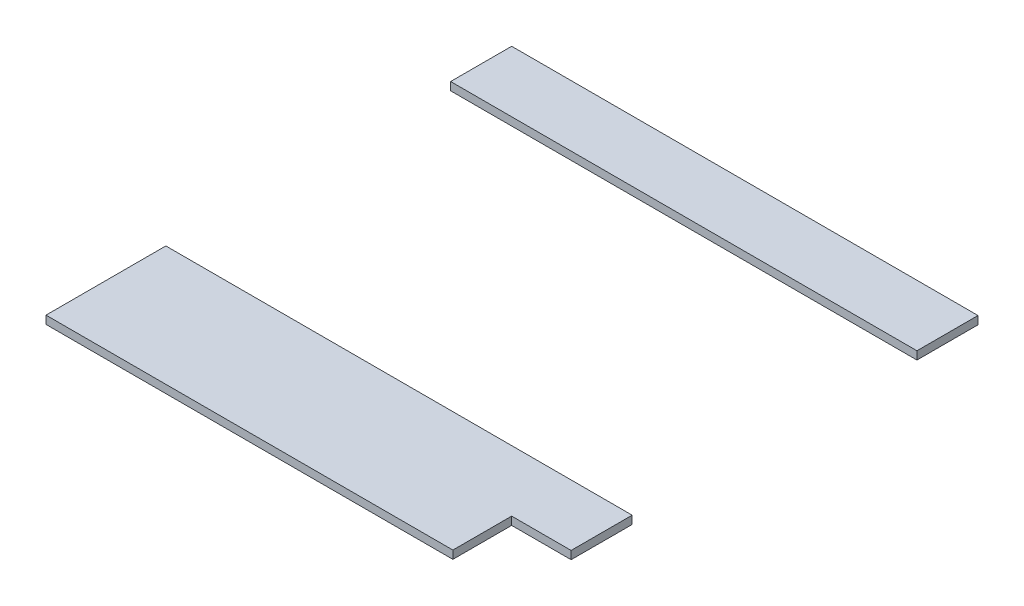
ISO-10303-21;
HEADER;
FILE_DESCRIPTION(('STEP AP214'),'2;1');
FILE_NAME('part.step','',(''),(''),'','','');
FILE_SCHEMA(('AUTOMOTIVE_DESIGN { 1 0 10303 214 1 1 1 1 }'));
ENDSEC;
DATA;
#1=APPLICATION_CONTEXT('core data for automotive mechanical design processes');
#2=APPLICATION_PROTOCOL_DEFINITION('international standard','automotive_design',2000,#1);
#3=PRODUCT_CONTEXT('',#1,'mechanical');
#4=PRODUCT('Part','Part','',(#3));
#5=PRODUCT_RELATED_PRODUCT_CATEGORY('part','',(#4));
#6=PRODUCT_DEFINITION_FORMATION('','',#4);
#7=PRODUCT_DEFINITION_CONTEXT('part definition',#1,'design');
#8=PRODUCT_DEFINITION('design','',#6,#7);
#9=PRODUCT_DEFINITION_SHAPE('','',#8);
#10=(LENGTH_UNIT() NAMED_UNIT(*) SI_UNIT(.MILLI.,.METRE.));
#11=(NAMED_UNIT(*) PLANE_ANGLE_UNIT() SI_UNIT($,.RADIAN.));
#12=(NAMED_UNIT(*) SI_UNIT($,.STERADIAN.) SOLID_ANGLE_UNIT());
#13=UNCERTAINTY_MEASURE_WITH_UNIT(LENGTH_MEASURE(1.E-05),#10,'distance_accuracy_value','');
#14=(GEOMETRIC_REPRESENTATION_CONTEXT(3) GLOBAL_UNCERTAINTY_ASSIGNED_CONTEXT((#13)) GLOBAL_UNIT_ASSIGNED_CONTEXT((#10,
#11,#12)) REPRESENTATION_CONTEXT('',''));
#15=CARTESIAN_POINT('',(0.,0.,0.));
#16=DIRECTION('',(0.,0.,1.));
#17=DIRECTION('',(1.,0.,0.));
#18=AXIS2_PLACEMENT_3D('',#15,#16,#17);
#19=CARTESIAN_POINT('',(104.2,-3.20000000000002,-80.6395610261527));
#20=DIRECTION('',(1.,0.,0.));
#21=DIRECTION('',(0.,0.,-1.));
#22=AXIS2_PLACEMENT_3D('',#19,#20,#21);
#23=PLANE('',#22);
#24=DIRECTION('',(0.,0.,-1.));
#25=VECTOR('',#24,1.);
#26=CARTESIAN_POINT('',(104.2,0.,-80.6395610261527));
#27=LINE('',#26,#25);
#28=CARTESIAN_POINT('',(104.2,0.,-56.4395610261526));
#29=VERTEX_POINT('',#28);
#30=CARTESIAN_POINT('',(104.2,0.,-80.6395610261527));
#31=VERTEX_POINT('',#30);
#32=EDGE_CURVE('E107',#29,#31,#27,.T.);
#33=ORIENTED_EDGE('',*,*,#32,.F.);
#34=DIRECTION('',(0.,1.,0.));
#35=VECTOR('',#34,1.);
#36=CARTESIAN_POINT('',(104.2,-3.20000000000002,-56.4395610261526));
#37=LINE('',#36,#35);
#38=CARTESIAN_POINT('',(104.2,-3.20000000000002,-56.4395610261526));
#39=VERTEX_POINT('',#38);
#40=EDGE_CURVE('E12',#39,#29,#37,.T.);
#41=ORIENTED_EDGE('',*,*,#40,.F.);
#42=DIRECTION('',(0.,0.,-1.));
#43=VECTOR('',#42,1.);
#44=CARTESIAN_POINT('',(104.2,-3.20000000000002,-80.6395610261527));
#45=LINE('',#44,#43);
#46=CARTESIAN_POINT('',(104.2,-3.20000000000002,-80.6395610261527));
#47=VERTEX_POINT('',#46);
#48=EDGE_CURVE('E101',#39,#47,#45,.T.);
#49=ORIENTED_EDGE('',*,*,#48,.T.);
#50=DIRECTION('',(0.,1.,0.));
#51=VECTOR('',#50,1.);
#52=CARTESIAN_POINT('',(104.2,-3.20000000000002,-80.6395610261527));
#53=LINE('',#52,#51);
#54=EDGE_CURVE('E46',#47,#31,#53,.T.);
#55=ORIENTED_EDGE('',*,*,#54,.T.);
#56=EDGE_LOOP('',(#33,#41,#49,#55));
#57=FACE_BOUND('',#56,.T.);
#58=ADVANCED_FACE('F43',(#57),#23,.T.);
#59=CARTESIAN_POINT('',(104.2,-3.20000000000002,-56.4395610261526));
#60=DIRECTION('',(0.,0.,1.));
#61=DIRECTION('',(1.,0.,0.));
#62=AXIS2_PLACEMENT_3D('',#59,#60,#61);
#63=PLANE('',#62);
#64=DIRECTION('',(1.,0.,0.));
#65=VECTOR('',#64,1.);
#66=CARTESIAN_POINT('',(104.2,0.,-56.4395610261526));
#67=LINE('',#66,#65);
#68=CARTESIAN_POINT('',(-80.6395610261527,0.,-56.4395610261526));
#69=VERTEX_POINT('',#68);
#70=EDGE_CURVE('E103',#69,#29,#67,.T.);
#71=ORIENTED_EDGE('',*,*,#70,.F.);
#72=DIRECTION('',(0.,1.,0.));
#73=VECTOR('',#72,1.);
#74=CARTESIAN_POINT('',(-80.6395610261527,-3.20000000000002,-56.4395610261526));
#75=LINE('',#74,#73);
#76=CARTESIAN_POINT('',(-80.6395610261527,-3.20000000000002,-56.4395610261526));
#77=VERTEX_POINT('',#76);
#78=EDGE_CURVE('E52',#77,#69,#75,.T.);
#79=ORIENTED_EDGE('',*,*,#78,.F.);
#80=DIRECTION('',(1.,0.,0.));
#81=VECTOR('',#80,1.);
#82=CARTESIAN_POINT('',(104.2,-3.20000000000002,-56.4395610261526));
#83=LINE('',#82,#81);
#84=EDGE_CURVE('E98',#77,#39,#83,.T.);
#85=ORIENTED_EDGE('',*,*,#84,.T.);
#86=ORIENTED_EDGE('',*,*,#40,.T.);
#87=EDGE_LOOP('',(#71,#79,#85,#86));
#88=FACE_BOUND('',#87,.T.);
#89=ADVANCED_FACE('F117',(#88),#63,.T.);
#90=CARTESIAN_POINT('',(-80.6395610261527,-3.20000000000002,-56.4395610261526));
#91=DIRECTION('',(-1.,0.,0.));
#92=DIRECTION('',(0.,0.,1.));
#93=AXIS2_PLACEMENT_3D('',#90,#91,#92);
#94=PLANE('',#93);
#95=DIRECTION('',(0.,0.,1.));
#96=VECTOR('',#95,1.);
#97=CARTESIAN_POINT('',(-80.6395610261527,0.,-56.4395610261526));
#98=LINE('',#97,#96);
#99=CARTESIAN_POINT('',(-80.6395610261527,0.,-80.6395610261527));
#100=VERTEX_POINT('',#99);
#101=EDGE_CURVE('E93',#100,#69,#98,.T.);
#102=ORIENTED_EDGE('',*,*,#101,.F.);
#103=DIRECTION('',(0.,1.,0.));
#104=VECTOR('',#103,1.);
#105=CARTESIAN_POINT('',(-80.6395610261527,-3.20000000000002,-80.6395610261527));
#106=LINE('',#105,#104);
#107=CARTESIAN_POINT('',(-80.6395610261527,-3.20000000000002,-80.6395610261527));
#108=VERTEX_POINT('',#107);
#109=EDGE_CURVE('E88',#108,#100,#106,.T.);
#110=ORIENTED_EDGE('',*,*,#109,.F.);
#111=DIRECTION('',(0.,0.,1.));
#112=VECTOR('',#111,1.);
#113=CARTESIAN_POINT('',(-80.6395610261527,-3.20000000000002,-56.4395610261526));
#114=LINE('',#113,#112);
#115=EDGE_CURVE('E91',#108,#77,#114,.T.);
#116=ORIENTED_EDGE('',*,*,#115,.T.);
#117=ORIENTED_EDGE('',*,*,#78,.T.);
#118=EDGE_LOOP('',(#102,#110,#116,#117));
#119=FACE_BOUND('',#118,.T.);
#120=ADVANCED_FACE('F90',(#119),#94,.T.);
#121=CARTESIAN_POINT('',(-80.6395610261527,-3.20000000000002,-80.6395610261527));
#122=DIRECTION('',(0.,0.,-1.));
#123=DIRECTION('',(-1.,0.,0.));
#124=AXIS2_PLACEMENT_3D('',#121,#122,#123);
#125=PLANE('',#124);
#126=DIRECTION('',(-1.,0.,0.));
#127=VECTOR('',#126,1.);
#128=CARTESIAN_POINT('',(-80.6395610261527,0.,-80.6395610261527));
#129=LINE('',#128,#127);
#130=EDGE_CURVE('E110',#31,#100,#129,.T.);
#131=ORIENTED_EDGE('',*,*,#130,.F.);
#132=ORIENTED_EDGE('',*,*,#54,.F.);
#133=DIRECTION('',(-1.,0.,0.));
#134=VECTOR('',#133,1.);
#135=CARTESIAN_POINT('',(-80.6395610261527,-3.20000000000002,-80.6395610261527));
#136=LINE('',#135,#134);
#137=EDGE_CURVE('E97',#47,#108,#136,.T.);
#138=ORIENTED_EDGE('',*,*,#137,.T.);
#139=ORIENTED_EDGE('',*,*,#109,.T.);
#140=EDGE_LOOP('',(#131,#132,#138,#139));
#141=FACE_BOUND('',#140,.T.);
#142=ADVANCED_FACE('F100',(#141),#125,.T.);
#143=CARTESIAN_POINT('',(0.,-3.20000000000002,0.));
#144=DIRECTION('',(0.,-1.,0.));
#145=DIRECTION('',(0.,0.,-1.));
#146=AXIS2_PLACEMENT_3D('',#143,#144,#145);
#147=PLANE('',#146);
#148=ORIENTED_EDGE('',*,*,#48,.F.);
#149=ORIENTED_EDGE('',*,*,#84,.F.);
#150=ORIENTED_EDGE('',*,*,#115,.F.);
#151=ORIENTED_EDGE('',*,*,#137,.F.);
#152=EDGE_LOOP('',(#148,#149,#150,#151));
#153=FACE_BOUND('',#152,.T.);
#154=ADVANCED_FACE('F96',(#153),#147,.T.);
#155=CARTESIAN_POINT('',(0.,0.,0.));
#156=DIRECTION('',(0.,-1.,0.));
#157=DIRECTION('',(0.,0.,-1.));
#158=AXIS2_PLACEMENT_3D('',#155,#156,#157);
#159=PLANE('',#158);
#160=ORIENTED_EDGE('',*,*,#32,.T.);
#161=ORIENTED_EDGE('',*,*,#130,.T.);
#162=ORIENTED_EDGE('',*,*,#101,.T.);
#163=ORIENTED_EDGE('',*,*,#70,.T.);
#164=EDGE_LOOP('',(#160,#161,#162,#163));
#165=FACE_BOUND('',#164,.T.);
#166=ADVANCED_FACE('F116',(#165),#159,.F.);
#167=CLOSED_SHELL('',(#58,#89,#120,#142,#154,#166));
#168=MANIFOLD_SOLID_BREP('B2',#167);
#169=CARTESIAN_POINT('',(-80.6395610261527,-3.20000000000002,103.939561026153));
#170=DIRECTION('',(-1.,0.,0.));
#171=DIRECTION('',(0.,0.,1.));
#172=AXIS2_PLACEMENT_3D('',#169,#170,#171);
#173=PLANE('',#172);
#174=DIRECTION('',(0.,0.,1.));
#175=VECTOR('',#174,1.);
#176=CARTESIAN_POINT('',(-80.6395610261527,0.,103.939561026153));
#177=LINE('',#176,#175);
#178=CARTESIAN_POINT('',(-80.6395610261527,0.,56.4395610261526));
#179=VERTEX_POINT('',#178);
#180=CARTESIAN_POINT('',(-80.6395610261527,0.,103.939561026153));
#181=VERTEX_POINT('',#180);
#182=EDGE_CURVE('E252',#179,#181,#177,.T.);
#183=ORIENTED_EDGE('',*,*,#182,.F.);
#184=DIRECTION('',(0.,1.,0.));
#185=VECTOR('',#184,1.);
#186=CARTESIAN_POINT('',(-80.6395610261527,-3.20000000000002,56.4395610261526));
#187=LINE('',#186,#185);
#188=CARTESIAN_POINT('',(-80.6395610261527,-3.20000000000002,56.4395610261526));
#189=VERTEX_POINT('',#188);
#190=EDGE_CURVE('E41',#189,#179,#187,.T.);
#191=ORIENTED_EDGE('',*,*,#190,.F.);
#192=DIRECTION('',(0.,0.,1.));
#193=VECTOR('',#192,1.);
#194=CARTESIAN_POINT('',(-80.6395610261527,-3.20000000000002,103.939561026153));
#195=LINE('',#194,#193);
#196=CARTESIAN_POINT('',(-80.6395610261527,-3.20000000000002,103.939561026153));
#197=VERTEX_POINT('',#196);
#198=EDGE_CURVE('E266',#189,#197,#195,.T.);
#199=ORIENTED_EDGE('',*,*,#198,.T.);
#200=DIRECTION('',(0.,1.,0.));
#201=VECTOR('',#200,1.);
#202=CARTESIAN_POINT('',(-80.6395610261527,-3.20000000000002,103.939561026153));
#203=LINE('',#202,#201);
#204=EDGE_CURVE('E170',#197,#181,#203,.T.);
#205=ORIENTED_EDGE('',*,*,#204,.T.);
#206=EDGE_LOOP('',(#183,#191,#199,#205));
#207=FACE_BOUND('',#206,.T.);
#208=ADVANCED_FACE('F167',(#207),#173,.T.);
#209=CARTESIAN_POINT('',(-80.6395610261527,-3.20000000000002,56.4395610261526));
#210=DIRECTION('',(0.,0.,-1.));
#211=DIRECTION('',(-1.,0.,0.));
#212=AXIS2_PLACEMENT_3D('',#209,#210,#211);
#213=PLANE('',#212);
#214=DIRECTION('',(-1.,0.,0.));
#215=VECTOR('',#214,1.);
#216=CARTESIAN_POINT('',(-80.6395610261527,0.,56.4395610261526));
#217=LINE('',#216,#215);
#218=CARTESIAN_POINT('',(104.2,0.,56.4395610261526));
#219=VERTEX_POINT('',#218);
#220=EDGE_CURVE('E264',#219,#179,#217,.T.);
#221=ORIENTED_EDGE('',*,*,#220,.F.);
#222=DIRECTION('',(0.,1.,0.));
#223=VECTOR('',#222,1.);
#224=CARTESIAN_POINT('',(104.2,-3.20000000000002,56.4395610261526));
#225=LINE('',#224,#223);
#226=CARTESIAN_POINT('',(104.2,-3.20000000000002,56.4395610261526));
#227=VERTEX_POINT('',#226);
#228=EDGE_CURVE('E176',#227,#219,#225,.T.);
#229=ORIENTED_EDGE('',*,*,#228,.F.);
#230=DIRECTION('',(-1.,0.,0.));
#231=VECTOR('',#230,1.);
#232=CARTESIAN_POINT('',(-80.6395610261527,-3.20000000000002,56.4395610261526));
#233=LINE('',#232,#231);
#234=EDGE_CURVE('E242',#227,#189,#233,.T.);
#235=ORIENTED_EDGE('',*,*,#234,.T.);
#236=ORIENTED_EDGE('',*,*,#190,.T.);
#237=EDGE_LOOP('',(#221,#229,#235,#236));
#238=FACE_BOUND('',#237,.T.);
#239=ADVANCED_FACE('F274',(#238),#213,.T.);
#240=CARTESIAN_POINT('',(104.2,-3.20000000000002,80.6395610261527));
#241=DIRECTION('',(1.,0.,0.));
#242=DIRECTION('',(0.,0.,-1.));
#243=AXIS2_PLACEMENT_3D('',#240,#241,#242);
#244=PLANE('',#243);
#245=DIRECTION('',(0.,0.,-1.));
#246=VECTOR('',#245,1.);
#247=CARTESIAN_POINT('',(104.2,0.,80.6395610261527));
#248=LINE('',#247,#246);
#249=CARTESIAN_POINT('',(104.2,0.,80.6395610261527));
#250=VERTEX_POINT('',#249);
#251=EDGE_CURVE('E229',#250,#219,#248,.T.);
#252=ORIENTED_EDGE('',*,*,#251,.F.);
#253=DIRECTION('',(0.,1.,0.));
#254=VECTOR('',#253,1.);
#255=CARTESIAN_POINT('',(104.2,-3.20000000000002,80.6395610261527));
#256=LINE('',#255,#254);
#257=CARTESIAN_POINT('',(104.2,-3.20000000000002,80.6395610261527));
#258=VERTEX_POINT('',#257);
#259=EDGE_CURVE('E224',#258,#250,#256,.T.);
#260=ORIENTED_EDGE('',*,*,#259,.F.);
#261=DIRECTION('',(0.,0.,-1.));
#262=VECTOR('',#261,1.);
#263=CARTESIAN_POINT('',(104.2,-3.20000000000002,80.6395610261527));
#264=LINE('',#263,#262);
#265=EDGE_CURVE('E227',#258,#227,#264,.T.);
#266=ORIENTED_EDGE('',*,*,#265,.T.);
#267=ORIENTED_EDGE('',*,*,#228,.T.);
#268=EDGE_LOOP('',(#252,#260,#266,#267));
#269=FACE_BOUND('',#268,.T.);
#270=ADVANCED_FACE('F226',(#269),#244,.T.);
#271=CARTESIAN_POINT('',(80.6395610261527,-3.20000000000002,80.6395610261527));
#272=DIRECTION('',(0.,0.,1.));
#273=DIRECTION('',(1.,0.,0.));
#274=AXIS2_PLACEMENT_3D('',#271,#272,#273);
#275=PLANE('',#274);
#276=DIRECTION('',(1.,0.,0.));
#277=VECTOR('',#276,1.);
#278=CARTESIAN_POINT('',(80.6395610261527,0.,80.6395610261527));
#279=LINE('',#278,#277);
#280=CARTESIAN_POINT('',(80.6395610261527,0.,80.6395610261527));
#281=VERTEX_POINT('',#280);
#282=EDGE_CURVE('E261',#281,#250,#279,.T.);
#283=ORIENTED_EDGE('',*,*,#282,.F.);
#284=DIRECTION('',(0.,1.,0.));
#285=VECTOR('',#284,1.);
#286=CARTESIAN_POINT('',(80.6395610261527,-3.20000000000002,80.6395610261527));
#287=LINE('',#286,#285);
#288=CARTESIAN_POINT('',(80.6395610261527,-3.20000000000002,80.6395610261527));
#289=VERTEX_POINT('',#288);
#290=EDGE_CURVE('E234',#289,#281,#287,.T.);
#291=ORIENTED_EDGE('',*,*,#290,.F.);
#292=DIRECTION('',(1.,0.,0.));
#293=VECTOR('',#292,1.);
#294=CARTESIAN_POINT('',(80.6395610261527,-3.20000000000002,80.6395610261527));
#295=LINE('',#294,#293);
#296=EDGE_CURVE('E240',#289,#258,#295,.T.);
#297=ORIENTED_EDGE('',*,*,#296,.T.);
#298=ORIENTED_EDGE('',*,*,#259,.T.);
#299=EDGE_LOOP('',(#283,#291,#297,#298));
#300=FACE_BOUND('',#299,.T.);
#301=ADVANCED_FACE('F244',(#300),#275,.T.);
#302=CARTESIAN_POINT('',(80.6395610261527,-3.20000000000002,103.939561026153));
#303=DIRECTION('',(1.,0.,0.));
#304=DIRECTION('',(0.,0.,-1.));
#305=AXIS2_PLACEMENT_3D('',#302,#303,#304);
#306=PLANE('',#305);
#307=DIRECTION('',(0.,0.,-1.));
#308=VECTOR('',#307,1.);
#309=CARTESIAN_POINT('',(80.6395610261527,0.,103.939561026153));
#310=LINE('',#309,#308);
#311=CARTESIAN_POINT('',(80.6395610261527,0.,103.939561026153));
#312=VERTEX_POINT('',#311);
#313=EDGE_CURVE('E258',#312,#281,#310,.T.);
#314=ORIENTED_EDGE('',*,*,#313,.F.);
#315=DIRECTION('',(0.,1.,0.));
#316=VECTOR('',#315,1.);
#317=CARTESIAN_POINT('',(80.6395610261527,-3.20000000000002,103.939561026153));
#318=LINE('',#317,#316);
#319=CARTESIAN_POINT('',(80.6395610261527,-3.20000000000002,103.939561026153));
#320=VERTEX_POINT('',#319);
#321=EDGE_CURVE('E269',#320,#312,#318,.T.);
#322=ORIENTED_EDGE('',*,*,#321,.F.);
#323=DIRECTION('',(0.,0.,-1.));
#324=VECTOR('',#323,1.);
#325=CARTESIAN_POINT('',(80.6395610261527,-3.20000000000002,103.939561026153));
#326=LINE('',#325,#324);
#327=EDGE_CURVE('E245',#320,#289,#326,.T.);
#328=ORIENTED_EDGE('',*,*,#327,.T.);
#329=ORIENTED_EDGE('',*,*,#290,.T.);
#330=EDGE_LOOP('',(#314,#322,#328,#329));
#331=FACE_BOUND('',#330,.T.);
#332=ADVANCED_FACE('F287',(#331),#306,.T.);
#333=CARTESIAN_POINT('',(-80.6395610261527,-3.20000000000002,103.939561026153));
#334=DIRECTION('',(0.,0.,1.));
#335=DIRECTION('',(1.,0.,0.));
#336=AXIS2_PLACEMENT_3D('',#333,#334,#335);
#337=PLANE('',#336);
#338=DIRECTION('',(1.,0.,0.));
#339=VECTOR('',#338,1.);
#340=CARTESIAN_POINT('',(-80.6395610261527,0.,103.939561026153));
#341=LINE('',#340,#339);
#342=EDGE_CURVE('E255',#181,#312,#341,.T.);
#343=ORIENTED_EDGE('',*,*,#342,.F.);
#344=ORIENTED_EDGE('',*,*,#204,.F.);
#345=DIRECTION('',(1.,0.,0.));
#346=VECTOR('',#345,1.);
#347=CARTESIAN_POINT('',(-80.6395610261527,-3.20000000000002,103.939561026153));
#348=LINE('',#347,#346);
#349=EDGE_CURVE('E247',#197,#320,#348,.T.);
#350=ORIENTED_EDGE('',*,*,#349,.T.);
#351=ORIENTED_EDGE('',*,*,#321,.T.);
#352=EDGE_LOOP('',(#343,#344,#350,#351));
#353=FACE_BOUND('',#352,.T.);
#354=ADVANCED_FACE('F271',(#353),#337,.T.);
#355=CARTESIAN_POINT('',(0.,-3.20000000000002,0.));
#356=DIRECTION('',(0.,-1.,0.));
#357=DIRECTION('',(0.,0.,-1.));
#358=AXIS2_PLACEMENT_3D('',#355,#356,#357);
#359=PLANE('',#358);
#360=ORIENTED_EDGE('',*,*,#198,.F.);
#361=ORIENTED_EDGE('',*,*,#234,.F.);
#362=ORIENTED_EDGE('',*,*,#265,.F.);
#363=ORIENTED_EDGE('',*,*,#296,.F.);
#364=ORIENTED_EDGE('',*,*,#327,.F.);
#365=ORIENTED_EDGE('',*,*,#349,.F.);
#366=EDGE_LOOP('',(#360,#361,#362,#363,#364,#365));
#367=FACE_BOUND('',#366,.T.);
#368=ADVANCED_FACE('F238',(#367),#359,.T.);
#369=CARTESIAN_POINT('',(0.,0.,0.));
#370=DIRECTION('',(0.,-1.,0.));
#371=DIRECTION('',(0.,0.,-1.));
#372=AXIS2_PLACEMENT_3D('',#369,#370,#371);
#373=PLANE('',#372);
#374=ORIENTED_EDGE('',*,*,#182,.T.);
#375=ORIENTED_EDGE('',*,*,#342,.T.);
#376=ORIENTED_EDGE('',*,*,#313,.T.);
#377=ORIENTED_EDGE('',*,*,#282,.T.);
#378=ORIENTED_EDGE('',*,*,#251,.T.);
#379=ORIENTED_EDGE('',*,*,#220,.T.);
#380=EDGE_LOOP('',(#374,#375,#376,#377,#378,#379));
#381=FACE_BOUND('',#380,.T.);
#382=ADVANCED_FACE('F273',(#381),#373,.F.);
#383=CLOSED_SHELL('',(#208,#239,#270,#301,#332,#354,#368,#382));
#384=MANIFOLD_SOLID_BREP('B6',#383);
#385=ADVANCED_BREP_SHAPE_REPRESENTATION('',(#18,#168,#384),#14);
#386=SHAPE_DEFINITION_REPRESENTATION(#9,#385);
ENDSEC;
END-ISO-10303-21;
